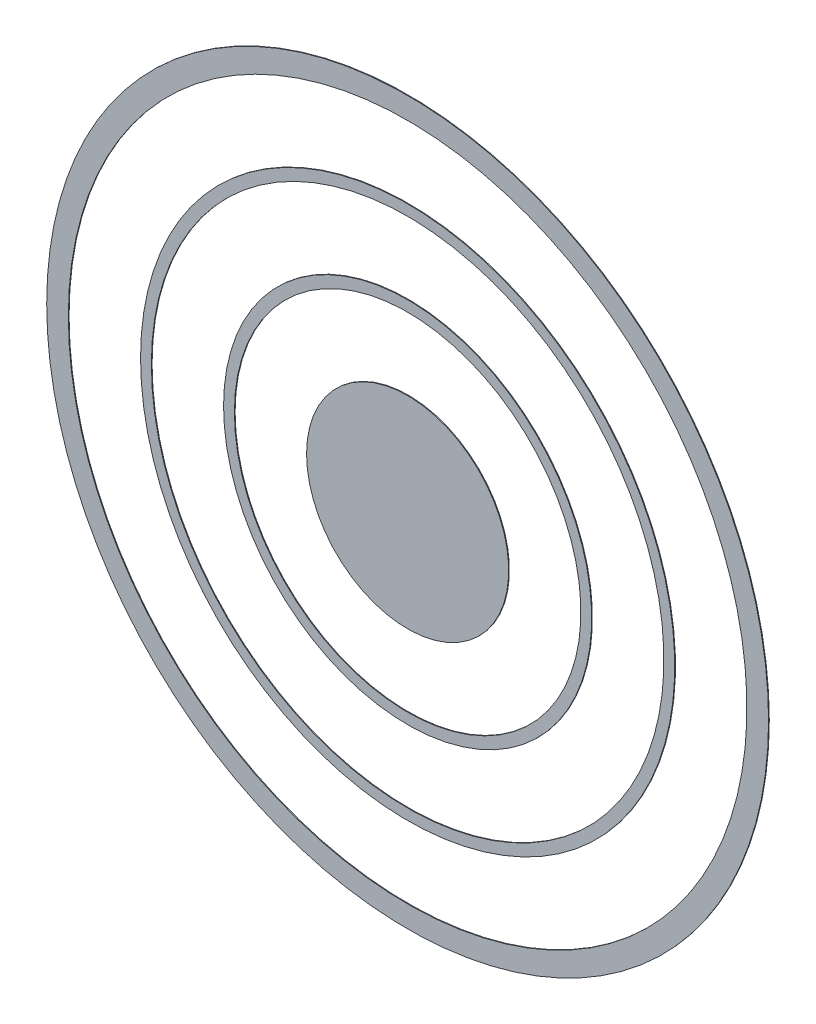
ISO-10303-21;
HEADER;
FILE_DESCRIPTION(('STEP AP214'),'2;1');
FILE_NAME('part.step','',(''),(''),'','','');
FILE_SCHEMA(('AUTOMOTIVE_DESIGN { 1 0 10303 214 1 1 1 1 }'));
ENDSEC;
DATA;
#1=APPLICATION_CONTEXT('core data for automotive mechanical design processes');
#2=APPLICATION_PROTOCOL_DEFINITION('international standard','automotive_design',2000,#1);
#3=PRODUCT_CONTEXT('',#1,'mechanical');
#4=PRODUCT('Part','Part','',(#3));
#5=PRODUCT_RELATED_PRODUCT_CATEGORY('part','',(#4));
#6=PRODUCT_DEFINITION_FORMATION('','',#4);
#7=PRODUCT_DEFINITION_CONTEXT('part definition',#1,'design');
#8=PRODUCT_DEFINITION('design','',#6,#7);
#9=PRODUCT_DEFINITION_SHAPE('','',#8);
#10=(LENGTH_UNIT() NAMED_UNIT(*) SI_UNIT(.MILLI.,.METRE.));
#11=(NAMED_UNIT(*) PLANE_ANGLE_UNIT() SI_UNIT($,.RADIAN.));
#12=(NAMED_UNIT(*) SI_UNIT($,.STERADIAN.) SOLID_ANGLE_UNIT());
#13=UNCERTAINTY_MEASURE_WITH_UNIT(LENGTH_MEASURE(1.E-05),#10,'distance_accuracy_value','');
#14=(GEOMETRIC_REPRESENTATION_CONTEXT(3) GLOBAL_UNCERTAINTY_ASSIGNED_CONTEXT((#13)) GLOBAL_UNIT_ASSIGNED_CONTEXT((#10,
#11,#12)) REPRESENTATION_CONTEXT('',''));
#15=CARTESIAN_POINT('',(0.,0.,0.));
#16=DIRECTION('',(0.,0.,1.));
#17=DIRECTION('',(1.,0.,0.));
#18=AXIS2_PLACEMENT_3D('',#15,#16,#17);
#19=CARTESIAN_POINT('',(0.,0.,0.01));
#20=DIRECTION('',(0.,0.,-1.));
#21=DIRECTION('',(-1.,0.,0.));
#22=AXIS2_PLACEMENT_3D('',#19,#20,#21);
#23=CYLINDRICAL_SURFACE('',#22,1.4);
#24=CARTESIAN_POINT('',(0.,0.,0.01));
#25=DIRECTION('',(0.,0.,1.));
#26=DIRECTION('',(1.,0.,0.));
#27=AXIS2_PLACEMENT_3D('',#24,#25,#26);
#28=CIRCLE('',#27,1.4);
#29=CARTESIAN_POINT('',(-1.4,0.,0.01));
#30=VERTEX_POINT('',#29);
#31=EDGE_CURVE('E12',#30,#30,#28,.T.);
#32=CARTESIAN_POINT('',(0.,0.,0.));
#33=DIRECTION('',(0.,0.,1.));
#34=DIRECTION('',(1.,0.,0.));
#35=AXIS2_PLACEMENT_3D('',#32,#33,#34);
#36=CIRCLE('',#35,1.4);
#37=CARTESIAN_POINT('',(-1.4,0.,0.));
#38=VERTEX_POINT('',#37);
#39=EDGE_CURVE('E83',#38,#38,#36,.T.);
#40=CARTESIAN_POINT('',(-1.4,0.,0.01));
#41=CARTESIAN_POINT('',(-1.4,0.,0.00989583333333333));
#42=CARTESIAN_POINT('',(-1.4,0.,0.00979166666666667));
#43=CARTESIAN_POINT('',(-1.4,0.,0.00958333333333333));
#44=CARTESIAN_POINT('',(-1.4,0.,0.00947916666666667));
#45=CARTESIAN_POINT('',(-1.4,0.,0.00927083333333333));
#46=CARTESIAN_POINT('',(-1.4,0.,0.00916666666666667));
#47=CARTESIAN_POINT('',(-1.4,0.,0.00895833333333333));
#48=CARTESIAN_POINT('',(-1.4,0.,0.00885416666666667));
#49=CARTESIAN_POINT('',(-1.4,0.,0.00864583333333333));
#50=CARTESIAN_POINT('',(-1.4,0.,0.00854166666666667));
#51=CARTESIAN_POINT('',(-1.4,0.,0.00833333333333333));
#52=CARTESIAN_POINT('',(-1.4,0.,0.00822916666666667));
#53=CARTESIAN_POINT('',(-1.4,0.,0.00802083333333333));
#54=CARTESIAN_POINT('',(-1.4,0.,0.00791666666666667));
#55=CARTESIAN_POINT('',(-1.4,0.,0.00770833333333333));
#56=CARTESIAN_POINT('',(-1.4,0.,0.00760416666666667));
#57=CARTESIAN_POINT('',(-1.4,0.,0.00739583333333333));
#58=CARTESIAN_POINT('',(-1.4,0.,0.00729166666666667));
#59=CARTESIAN_POINT('',(-1.4,0.,0.00708333333333333));
#60=CARTESIAN_POINT('',(-1.4,0.,0.00697916666666667));
#61=CARTESIAN_POINT('',(-1.4,0.,0.00677083333333333));
#62=CARTESIAN_POINT('',(-1.4,0.,0.00666666666666667));
#63=CARTESIAN_POINT('',(-1.4,0.,0.00645833333333333));
#64=CARTESIAN_POINT('',(-1.4,0.,0.00635416666666667));
#65=CARTESIAN_POINT('',(-1.4,0.,0.00614583333333333));
#66=CARTESIAN_POINT('',(-1.4,0.,0.00604166666666667));
#67=CARTESIAN_POINT('',(-1.4,0.,0.00583333333333333));
#68=CARTESIAN_POINT('',(-1.4,0.,0.00572916666666667));
#69=CARTESIAN_POINT('',(-1.4,0.,0.00552083333333333));
#70=CARTESIAN_POINT('',(-1.4,0.,0.00541666666666667));
#71=CARTESIAN_POINT('',(-1.4,0.,0.00520833333333333));
#72=CARTESIAN_POINT('',(-1.4,0.,0.00510416666666667));
#73=CARTESIAN_POINT('',(-1.4,0.,0.00489583333333333));
#74=CARTESIAN_POINT('',(-1.4,0.,0.00479166666666667));
#75=CARTESIAN_POINT('',(-1.4,0.,0.00458333333333333));
#76=CARTESIAN_POINT('',(-1.4,0.,0.00447916666666667));
#77=CARTESIAN_POINT('',(-1.4,0.,0.00427083333333333));
#78=CARTESIAN_POINT('',(-1.4,0.,0.00416666666666667));
#79=CARTESIAN_POINT('',(-1.4,0.,0.00395833333333333));
#80=CARTESIAN_POINT('',(-1.4,0.,0.00385416666666667));
#81=CARTESIAN_POINT('',(-1.4,0.,0.00364583333333333));
#82=CARTESIAN_POINT('',(-1.4,0.,0.00354166666666667));
#83=CARTESIAN_POINT('',(-1.4,0.,0.00333333333333333));
#84=CARTESIAN_POINT('',(-1.4,0.,0.00322916666666667));
#85=CARTESIAN_POINT('',(-1.4,0.,0.00302083333333333));
#86=CARTESIAN_POINT('',(-1.4,0.,0.00291666666666667));
#87=CARTESIAN_POINT('',(-1.4,0.,0.00270833333333333));
#88=CARTESIAN_POINT('',(-1.4,0.,0.00260416666666667));
#89=CARTESIAN_POINT('',(-1.4,0.,0.00239583333333333));
#90=CARTESIAN_POINT('',(-1.4,0.,0.00229166666666667));
#91=CARTESIAN_POINT('',(-1.4,0.,0.00208333333333333));
#92=CARTESIAN_POINT('',(-1.4,0.,0.00197916666666667));
#93=CARTESIAN_POINT('',(-1.4,0.,0.00177083333333333));
#94=CARTESIAN_POINT('',(-1.4,0.,0.00166666666666667));
#95=CARTESIAN_POINT('',(-1.4,0.,0.00145833333333333));
#96=CARTESIAN_POINT('',(-1.4,0.,0.00135416666666667));
#97=CARTESIAN_POINT('',(-1.4,0.,0.00114583333333333));
#98=CARTESIAN_POINT('',(-1.4,0.,0.00104166666666667));
#99=CARTESIAN_POINT('',(-1.4,0.,0.000833333333333334));
#100=CARTESIAN_POINT('',(-1.4,0.,0.000729166666666667));
#101=CARTESIAN_POINT('',(-1.4,0.,0.000520833333333334));
#102=CARTESIAN_POINT('',(-1.4,0.,0.000416666666666667));
#103=CARTESIAN_POINT('',(-1.4,0.,0.000208333333333334));
#104=CARTESIAN_POINT('',(-1.4,0.,0.000104166666666667));
#105=CARTESIAN_POINT('',(-1.4,0.,0.));
#106=B_SPLINE_CURVE_WITH_KNOTS('',3,(#40,#41,#42,#43,#44,#45,#46,#47,#48,#49,#50,#51,#52,#53,
#54,#55,#56,#57,#58,#59,#60,#61,#62,#63,#64,#65,#66,#67,#68,#69,#70,#71,#72,#73,#74,#75,#76,#77,
#78,#79,#80,#81,#82,#83,#84,#85,#86,#87,#88,#89,#90,#91,#92,#93,#94,#95,#96,#97,#98,#99,#100,
#101,#102,#103,#104,#105),.UNSPECIFIED.,.F.,.F.,(4,2,2,2,2,2,2,2,2,2,2,2,2,2,2,2,2,2,2,2,2,2,2,
2,2,2,2,2,2,2,2,2,4),(0.,0.000312500000000001,0.000625000000000002,0.000937500000000001,0.00125,
0.0015625,0.001875,0.0021875,0.0025,0.0028125,0.003125,0.0034375,0.00375,0.0040625,0.004375,
0.0046875,0.005,0.0053125,0.005625,0.0059375,0.00625,0.0065625,0.006875,0.0071875,0.0075,
0.0078125,0.008125,0.0084375,0.00875,0.0090625,0.009375,0.0096875,0.01),.UNSPECIFIED.);
#107=EDGE_CURVE('BSEAM80',#30,#38,#106,.T.);
#108=ORIENTED_EDGE('',*,*,#31,.F.);
#109=ORIENTED_EDGE('',*,*,#39,.T.);
#110=ORIENTED_EDGE('',*,*,#107,.T.);
#111=ORIENTED_EDGE('',*,*,#107,.F.);
#112=EDGE_LOOP('',(#108,#110,#109,#111));
#113=FACE_BOUND('',#112,.T.);
#114=ADVANCED_FACE('F80',(#113),#23,.T.);
#115=CARTESIAN_POINT('',(0.,0.,0.01));
#116=DIRECTION('',(0.,0.,1.));
#117=DIRECTION('',(1.,0.,0.));
#118=AXIS2_PLACEMENT_3D('',#115,#116,#117);
#119=PLANE('',#118);
#120=ORIENTED_EDGE('',*,*,#31,.T.);
#121=EDGE_LOOP('',(#120));
#122=FACE_BOUND('',#121,.T.);
#123=ADVANCED_FACE('F95',(#122),#119,.T.);
#124=CARTESIAN_POINT('',(0.,0.,0.));
#125=DIRECTION('',(0.,0.,1.));
#126=DIRECTION('',(1.,0.,0.));
#127=AXIS2_PLACEMENT_3D('',#124,#125,#126);
#128=PLANE('',#127);
#129=ORIENTED_EDGE('',*,*,#39,.F.);
#130=EDGE_LOOP('',(#129));
#131=FACE_BOUND('',#130,.T.);
#132=ADVANCED_FACE('F93',(#131),#128,.F.);
#133=CLOSED_SHELL('',(#114,#123,#132));
#134=MANIFOLD_SOLID_BREP('B2',#133);
#135=CARTESIAN_POINT('',(0.,0.,0.01));
#136=DIRECTION('',(0.,0.,-1.));
#137=DIRECTION('',(-1.,0.,0.));
#138=AXIS2_PLACEMENT_3D('',#135,#136,#137);
#139=CYLINDRICAL_SURFACE('',#138,2.4);
#140=CARTESIAN_POINT('',(0.,0.,0.01));
#141=DIRECTION('',(0.,0.,1.));
#142=DIRECTION('',(1.,0.,0.));
#143=AXIS2_PLACEMENT_3D('',#140,#141,#142);
#144=CIRCLE('',#143,2.4);
#145=CARTESIAN_POINT('',(-2.4,0.,0.01));
#146=VERTEX_POINT('',#145);
#147=EDGE_CURVE('E136',#146,#146,#144,.T.);
#148=CARTESIAN_POINT('',(0.,0.,0.));
#149=DIRECTION('',(0.,0.,1.));
#150=DIRECTION('',(1.,0.,0.));
#151=AXIS2_PLACEMENT_3D('',#148,#149,#150);
#152=CIRCLE('',#151,2.4);
#153=CARTESIAN_POINT('',(-2.4,0.,0.));
#154=VERTEX_POINT('',#153);
#155=EDGE_CURVE('E142',#154,#154,#152,.T.);
#156=CARTESIAN_POINT('',(-2.4,0.,0.01));
#157=CARTESIAN_POINT('',(-2.4,0.,0.00989583333333333));
#158=CARTESIAN_POINT('',(-2.4,0.,0.00979166666666667));
#159=CARTESIAN_POINT('',(-2.4,0.,0.00958333333333333));
#160=CARTESIAN_POINT('',(-2.4,0.,0.00947916666666667));
#161=CARTESIAN_POINT('',(-2.4,0.,0.00927083333333333));
#162=CARTESIAN_POINT('',(-2.4,0.,0.00916666666666667));
#163=CARTESIAN_POINT('',(-2.4,0.,0.00895833333333333));
#164=CARTESIAN_POINT('',(-2.4,0.,0.00885416666666667));
#165=CARTESIAN_POINT('',(-2.4,0.,0.00864583333333333));
#166=CARTESIAN_POINT('',(-2.4,0.,0.00854166666666667));
#167=CARTESIAN_POINT('',(-2.4,0.,0.00833333333333333));
#168=CARTESIAN_POINT('',(-2.4,0.,0.00822916666666667));
#169=CARTESIAN_POINT('',(-2.4,0.,0.00802083333333333));
#170=CARTESIAN_POINT('',(-2.4,0.,0.00791666666666667));
#171=CARTESIAN_POINT('',(-2.4,0.,0.00770833333333333));
#172=CARTESIAN_POINT('',(-2.4,0.,0.00760416666666667));
#173=CARTESIAN_POINT('',(-2.4,0.,0.00739583333333333));
#174=CARTESIAN_POINT('',(-2.4,0.,0.00729166666666667));
#175=CARTESIAN_POINT('',(-2.4,0.,0.00708333333333333));
#176=CARTESIAN_POINT('',(-2.4,0.,0.00697916666666667));
#177=CARTESIAN_POINT('',(-2.4,0.,0.00677083333333333));
#178=CARTESIAN_POINT('',(-2.4,0.,0.00666666666666667));
#179=CARTESIAN_POINT('',(-2.4,0.,0.00645833333333333));
#180=CARTESIAN_POINT('',(-2.4,0.,0.00635416666666667));
#181=CARTESIAN_POINT('',(-2.4,0.,0.00614583333333333));
#182=CARTESIAN_POINT('',(-2.4,0.,0.00604166666666667));
#183=CARTESIAN_POINT('',(-2.4,0.,0.00583333333333333));
#184=CARTESIAN_POINT('',(-2.4,0.,0.00572916666666667));
#185=CARTESIAN_POINT('',(-2.4,0.,0.00552083333333333));
#186=CARTESIAN_POINT('',(-2.4,0.,0.00541666666666667));
#187=CARTESIAN_POINT('',(-2.4,0.,0.00520833333333333));
#188=CARTESIAN_POINT('',(-2.4,0.,0.00510416666666667));
#189=CARTESIAN_POINT('',(-2.4,0.,0.00489583333333333));
#190=CARTESIAN_POINT('',(-2.4,0.,0.00479166666666667));
#191=CARTESIAN_POINT('',(-2.4,0.,0.00458333333333333));
#192=CARTESIAN_POINT('',(-2.4,0.,0.00447916666666667));
#193=CARTESIAN_POINT('',(-2.4,0.,0.00427083333333333));
#194=CARTESIAN_POINT('',(-2.4,0.,0.00416666666666667));
#195=CARTESIAN_POINT('',(-2.4,0.,0.00395833333333333));
#196=CARTESIAN_POINT('',(-2.4,0.,0.00385416666666667));
#197=CARTESIAN_POINT('',(-2.4,0.,0.00364583333333333));
#198=CARTESIAN_POINT('',(-2.4,0.,0.00354166666666667));
#199=CARTESIAN_POINT('',(-2.4,0.,0.00333333333333333));
#200=CARTESIAN_POINT('',(-2.4,0.,0.00322916666666667));
#201=CARTESIAN_POINT('',(-2.4,0.,0.00302083333333333));
#202=CARTESIAN_POINT('',(-2.4,0.,0.00291666666666667));
#203=CARTESIAN_POINT('',(-2.4,0.,0.00270833333333333));
#204=CARTESIAN_POINT('',(-2.4,0.,0.00260416666666667));
#205=CARTESIAN_POINT('',(-2.4,0.,0.00239583333333333));
#206=CARTESIAN_POINT('',(-2.4,0.,0.00229166666666667));
#207=CARTESIAN_POINT('',(-2.4,0.,0.00208333333333333));
#208=CARTESIAN_POINT('',(-2.4,0.,0.00197916666666667));
#209=CARTESIAN_POINT('',(-2.4,0.,0.00177083333333333));
#210=CARTESIAN_POINT('',(-2.4,0.,0.00166666666666667));
#211=CARTESIAN_POINT('',(-2.4,0.,0.00145833333333333));
#212=CARTESIAN_POINT('',(-2.4,0.,0.00135416666666667));
#213=CARTESIAN_POINT('',(-2.4,0.,0.00114583333333333));
#214=CARTESIAN_POINT('',(-2.4,0.,0.00104166666666667));
#215=CARTESIAN_POINT('',(-2.4,0.,0.000833333333333334));
#216=CARTESIAN_POINT('',(-2.4,0.,0.000729166666666667));
#217=CARTESIAN_POINT('',(-2.4,0.,0.000520833333333334));
#218=CARTESIAN_POINT('',(-2.4,0.,0.000416666666666667));
#219=CARTESIAN_POINT('',(-2.4,0.,0.000208333333333334));
#220=CARTESIAN_POINT('',(-2.4,0.,0.000104166666666667));
#221=CARTESIAN_POINT('',(-2.4,0.,0.));
#222=B_SPLINE_CURVE_WITH_KNOTS('',3,(#156,#157,#158,#159,#160,#161,#162,#163,#164,#165,#166,
#167,#168,#169,#170,#171,#172,#173,#174,#175,#176,#177,#178,#179,#180,#181,#182,#183,#184,#185,
#186,#187,#188,#189,#190,#191,#192,#193,#194,#195,#196,#197,#198,#199,#200,#201,#202,#203,#204,
#205,#206,#207,#208,#209,#210,#211,#212,#213,#214,#215,#216,#217,#218,#219,#220,#221),
.UNSPECIFIED.,.F.,.F.,(4,2,2,2,2,2,2,2,2,2,2,2,2,2,2,2,2,2,2,2,2,2,2,2,2,2,2,2,2,2,2,2,4),(0.,
0.000312499999999999,0.000624999999999998,0.000937499999999999,0.00125,0.0015625,0.001875,
0.0021875,0.0025,0.0028125,0.003125,0.0034375,0.00375,0.0040625,0.004375,0.0046875,0.005,
0.0053125,0.005625,0.0059375,0.00625,0.0065625,0.006875,0.0071875,0.0075,0.0078125,0.008125,
0.0084375,0.00875,0.0090625,0.009375,0.0096875,0.01),.UNSPECIFIED.);
#223=EDGE_CURVE('BSEAM129',#146,#154,#222,.T.);
#224=ORIENTED_EDGE('',*,*,#147,.T.);
#225=ORIENTED_EDGE('',*,*,#155,.F.);
#226=ORIENTED_EDGE('',*,*,#223,.T.);
#227=ORIENTED_EDGE('',*,*,#223,.F.);
#228=EDGE_LOOP('',(#224,#226,#225,#227));
#229=FACE_BOUND('',#228,.T.);
#230=ADVANCED_FACE('F129',(#229),#139,.F.);
#231=CARTESIAN_POINT('',(0.,0.,0.01));
#232=DIRECTION('',(0.,0.,-1.));
#233=DIRECTION('',(-1.,0.,0.));
#234=AXIS2_PLACEMENT_3D('',#231,#232,#233);
#235=CYLINDRICAL_SURFACE('',#234,2.55);
#236=CARTESIAN_POINT('',(0.,0.,0.01));
#237=DIRECTION('',(0.,0.,1.));
#238=DIRECTION('',(1.,0.,0.));
#239=AXIS2_PLACEMENT_3D('',#236,#237,#238);
#240=CIRCLE('',#239,2.55);
#241=CARTESIAN_POINT('',(-2.55,0.,0.01));
#242=VERTEX_POINT('',#241);
#243=EDGE_CURVE('E79',#242,#242,#240,.T.);
#244=CARTESIAN_POINT('',(0.,0.,0.));
#245=DIRECTION('',(0.,0.,1.));
#246=DIRECTION('',(1.,0.,0.));
#247=AXIS2_PLACEMENT_3D('',#244,#245,#246);
#248=CIRCLE('',#247,2.55);
#249=CARTESIAN_POINT('',(-2.55,0.,0.));
#250=VERTEX_POINT('',#249);
#251=EDGE_CURVE('E132',#250,#250,#248,.T.);
#252=CARTESIAN_POINT('',(-2.55,0.,0.01));
#253=CARTESIAN_POINT('',(-2.55,0.,0.00989583333333333));
#254=CARTESIAN_POINT('',(-2.55,0.,0.00979166666666667));
#255=CARTESIAN_POINT('',(-2.55,0.,0.00958333333333333));
#256=CARTESIAN_POINT('',(-2.55,0.,0.00947916666666667));
#257=CARTESIAN_POINT('',(-2.55,0.,0.00927083333333333));
#258=CARTESIAN_POINT('',(-2.55,0.,0.00916666666666667));
#259=CARTESIAN_POINT('',(-2.55,0.,0.00895833333333333));
#260=CARTESIAN_POINT('',(-2.55,0.,0.00885416666666667));
#261=CARTESIAN_POINT('',(-2.55,0.,0.00864583333333333));
#262=CARTESIAN_POINT('',(-2.55,0.,0.00854166666666667));
#263=CARTESIAN_POINT('',(-2.55,0.,0.00833333333333333));
#264=CARTESIAN_POINT('',(-2.55,0.,0.00822916666666667));
#265=CARTESIAN_POINT('',(-2.55,0.,0.00802083333333333));
#266=CARTESIAN_POINT('',(-2.55,0.,0.00791666666666667));
#267=CARTESIAN_POINT('',(-2.55,0.,0.00770833333333333));
#268=CARTESIAN_POINT('',(-2.55,0.,0.00760416666666667));
#269=CARTESIAN_POINT('',(-2.55,0.,0.00739583333333333));
#270=CARTESIAN_POINT('',(-2.55,0.,0.00729166666666667));
#271=CARTESIAN_POINT('',(-2.55,0.,0.00708333333333333));
#272=CARTESIAN_POINT('',(-2.55,0.,0.00697916666666667));
#273=CARTESIAN_POINT('',(-2.55,0.,0.00677083333333333));
#274=CARTESIAN_POINT('',(-2.55,0.,0.00666666666666667));
#275=CARTESIAN_POINT('',(-2.55,0.,0.00645833333333333));
#276=CARTESIAN_POINT('',(-2.55,0.,0.00635416666666667));
#277=CARTESIAN_POINT('',(-2.55,0.,0.00614583333333333));
#278=CARTESIAN_POINT('',(-2.55,0.,0.00604166666666667));
#279=CARTESIAN_POINT('',(-2.55,0.,0.00583333333333333));
#280=CARTESIAN_POINT('',(-2.55,0.,0.00572916666666667));
#281=CARTESIAN_POINT('',(-2.55,0.,0.00552083333333333));
#282=CARTESIAN_POINT('',(-2.55,0.,0.00541666666666667));
#283=CARTESIAN_POINT('',(-2.55,0.,0.00520833333333333));
#284=CARTESIAN_POINT('',(-2.55,0.,0.00510416666666667));
#285=CARTESIAN_POINT('',(-2.55,0.,0.00489583333333333));
#286=CARTESIAN_POINT('',(-2.55,0.,0.00479166666666667));
#287=CARTESIAN_POINT('',(-2.55,0.,0.00458333333333333));
#288=CARTESIAN_POINT('',(-2.55,0.,0.00447916666666667));
#289=CARTESIAN_POINT('',(-2.55,0.,0.00427083333333333));
#290=CARTESIAN_POINT('',(-2.55,0.,0.00416666666666667));
#291=CARTESIAN_POINT('',(-2.55,0.,0.00395833333333333));
#292=CARTESIAN_POINT('',(-2.55,0.,0.00385416666666667));
#293=CARTESIAN_POINT('',(-2.55,0.,0.00364583333333333));
#294=CARTESIAN_POINT('',(-2.55,0.,0.00354166666666667));
#295=CARTESIAN_POINT('',(-2.55,0.,0.00333333333333333));
#296=CARTESIAN_POINT('',(-2.55,0.,0.00322916666666667));
#297=CARTESIAN_POINT('',(-2.55,0.,0.00302083333333333));
#298=CARTESIAN_POINT('',(-2.55,0.,0.00291666666666667));
#299=CARTESIAN_POINT('',(-2.55,0.,0.00270833333333333));
#300=CARTESIAN_POINT('',(-2.55,0.,0.00260416666666667));
#301=CARTESIAN_POINT('',(-2.55,0.,0.00239583333333333));
#302=CARTESIAN_POINT('',(-2.55,0.,0.00229166666666667));
#303=CARTESIAN_POINT('',(-2.55,0.,0.00208333333333333));
#304=CARTESIAN_POINT('',(-2.55,0.,0.00197916666666667));
#305=CARTESIAN_POINT('',(-2.55,0.,0.00177083333333333));
#306=CARTESIAN_POINT('',(-2.55,0.,0.00166666666666667));
#307=CARTESIAN_POINT('',(-2.55,0.,0.00145833333333333));
#308=CARTESIAN_POINT('',(-2.55,0.,0.00135416666666667));
#309=CARTESIAN_POINT('',(-2.55,0.,0.00114583333333333));
#310=CARTESIAN_POINT('',(-2.55,0.,0.00104166666666667));
#311=CARTESIAN_POINT('',(-2.55,0.,0.000833333333333334));
#312=CARTESIAN_POINT('',(-2.55,0.,0.000729166666666667));
#313=CARTESIAN_POINT('',(-2.55,0.,0.000520833333333334));
#314=CARTESIAN_POINT('',(-2.55,0.,0.000416666666666667));
#315=CARTESIAN_POINT('',(-2.55,0.,0.000208333333333334));
#316=CARTESIAN_POINT('',(-2.55,0.,0.000104166666666667));
#317=CARTESIAN_POINT('',(-2.55,0.,0.));
#318=B_SPLINE_CURVE_WITH_KNOTS('',3,(#252,#253,#254,#255,#256,#257,#258,#259,#260,#261,#262,
#263,#264,#265,#266,#267,#268,#269,#270,#271,#272,#273,#274,#275,#276,#277,#278,#279,#280,#281,
#282,#283,#284,#285,#286,#287,#288,#289,#290,#291,#292,#293,#294,#295,#296,#297,#298,#299,#300,
#301,#302,#303,#304,#305,#306,#307,#308,#309,#310,#311,#312,#313,#314,#315,#316,#317),
.UNSPECIFIED.,.F.,.F.,(4,2,2,2,2,2,2,2,2,2,2,2,2,2,2,2,2,2,2,2,2,2,2,2,2,2,2,2,2,2,2,2,4),(0.,
0.000312500000000001,0.000625000000000002,0.000937500000000001,0.00125,0.0015625,0.001875,
0.0021875,0.0025,0.0028125,0.003125,0.0034375,0.00375,0.0040625,0.004375,0.0046875,0.005,
0.0053125,0.005625,0.0059375,0.00625,0.0065625,0.006875,0.0071875,0.0075,0.0078125,0.008125,
0.0084375,0.00875,0.0090625,0.009375,0.0096875,0.01),.UNSPECIFIED.);
#319=EDGE_CURVE('BSEAM149',#242,#250,#318,.T.);
#320=ORIENTED_EDGE('',*,*,#243,.F.);
#321=ORIENTED_EDGE('',*,*,#251,.T.);
#322=ORIENTED_EDGE('',*,*,#319,.T.);
#323=ORIENTED_EDGE('',*,*,#319,.F.);
#324=EDGE_LOOP('',(#320,#322,#321,#323));
#325=FACE_BOUND('',#324,.T.);
#326=ADVANCED_FACE('F149',(#325),#235,.T.);
#327=CARTESIAN_POINT('',(0.,0.,0.01));
#328=DIRECTION('',(0.,0.,1.));
#329=DIRECTION('',(1.,0.,0.));
#330=AXIS2_PLACEMENT_3D('',#327,#328,#329);
#331=PLANE('',#330);
#332=ORIENTED_EDGE('',*,*,#147,.F.);
#333=EDGE_LOOP('',(#332));
#334=FACE_BOUND('',#333,.T.);
#335=ORIENTED_EDGE('',*,*,#243,.T.);
#336=EDGE_LOOP('',(#335));
#337=FACE_BOUND('',#336,.T.);
#338=ADVANCED_FACE('F153',(#334,#337),#331,.T.);
#339=CARTESIAN_POINT('',(0.,0.,0.));
#340=DIRECTION('',(0.,0.,1.));
#341=DIRECTION('',(1.,0.,0.));
#342=AXIS2_PLACEMENT_3D('',#339,#340,#341);
#343=PLANE('',#342);
#344=ORIENTED_EDGE('',*,*,#155,.T.);
#345=EDGE_LOOP('',(#344));
#346=FACE_BOUND('',#345,.T.);
#347=ORIENTED_EDGE('',*,*,#251,.F.);
#348=EDGE_LOOP('',(#347));
#349=FACE_BOUND('',#348,.T.);
#350=ADVANCED_FACE('F151',(#346,#349),#343,.F.);
#351=CLOSED_SHELL('',(#230,#326,#338,#350));
#352=MANIFOLD_SOLID_BREP('B7',#351);
#353=CARTESIAN_POINT('',(0.,0.,0.01));
#354=DIRECTION('',(0.,0.,-1.));
#355=DIRECTION('',(-1.,0.,0.));
#356=AXIS2_PLACEMENT_3D('',#353,#354,#355);
#357=CYLINDRICAL_SURFACE('',#356,3.55);
#358=CARTESIAN_POINT('',(0.,0.,0.01));
#359=DIRECTION('',(0.,0.,1.));
#360=DIRECTION('',(1.,0.,0.));
#361=AXIS2_PLACEMENT_3D('',#358,#359,#360);
#362=CIRCLE('',#361,3.55);
#363=CARTESIAN_POINT('',(-3.55,0.,0.01));
#364=VERTEX_POINT('',#363);
#365=EDGE_CURVE('E205',#364,#364,#362,.T.);
#366=CARTESIAN_POINT('',(0.,0.,0.));
#367=DIRECTION('',(0.,0.,1.));
#368=DIRECTION('',(1.,0.,0.));
#369=AXIS2_PLACEMENT_3D('',#366,#367,#368);
#370=CIRCLE('',#369,3.55);
#371=CARTESIAN_POINT('',(-3.55,0.,0.));
#372=VERTEX_POINT('',#371);
#373=EDGE_CURVE('E211',#372,#372,#370,.T.);
#374=CARTESIAN_POINT('',(-3.55,0.,0.01));
#375=CARTESIAN_POINT('',(-3.55,0.,0.00989583333333333));
#376=CARTESIAN_POINT('',(-3.55,0.,0.00979166666666667));
#377=CARTESIAN_POINT('',(-3.55,0.,0.00958333333333333));
#378=CARTESIAN_POINT('',(-3.55,0.,0.00947916666666667));
#379=CARTESIAN_POINT('',(-3.55,0.,0.00927083333333333));
#380=CARTESIAN_POINT('',(-3.55,0.,0.00916666666666667));
#381=CARTESIAN_POINT('',(-3.55,0.,0.00895833333333333));
#382=CARTESIAN_POINT('',(-3.55,0.,0.00885416666666667));
#383=CARTESIAN_POINT('',(-3.55,0.,0.00864583333333333));
#384=CARTESIAN_POINT('',(-3.55,0.,0.00854166666666667));
#385=CARTESIAN_POINT('',(-3.55,0.,0.00833333333333333));
#386=CARTESIAN_POINT('',(-3.55,0.,0.00822916666666667));
#387=CARTESIAN_POINT('',(-3.55,0.,0.00802083333333333));
#388=CARTESIAN_POINT('',(-3.55,0.,0.00791666666666667));
#389=CARTESIAN_POINT('',(-3.55,0.,0.00770833333333333));
#390=CARTESIAN_POINT('',(-3.55,0.,0.00760416666666667));
#391=CARTESIAN_POINT('',(-3.55,0.,0.00739583333333333));
#392=CARTESIAN_POINT('',(-3.55,0.,0.00729166666666667));
#393=CARTESIAN_POINT('',(-3.55,0.,0.00708333333333333));
#394=CARTESIAN_POINT('',(-3.55,0.,0.00697916666666667));
#395=CARTESIAN_POINT('',(-3.55,0.,0.00677083333333333));
#396=CARTESIAN_POINT('',(-3.55,0.,0.00666666666666667));
#397=CARTESIAN_POINT('',(-3.55,0.,0.00645833333333333));
#398=CARTESIAN_POINT('',(-3.55,0.,0.00635416666666667));
#399=CARTESIAN_POINT('',(-3.55,0.,0.00614583333333333));
#400=CARTESIAN_POINT('',(-3.55,0.,0.00604166666666667));
#401=CARTESIAN_POINT('',(-3.55,0.,0.00583333333333333));
#402=CARTESIAN_POINT('',(-3.55,0.,0.00572916666666667));
#403=CARTESIAN_POINT('',(-3.55,0.,0.00552083333333333));
#404=CARTESIAN_POINT('',(-3.55,0.,0.00541666666666667));
#405=CARTESIAN_POINT('',(-3.55,0.,0.00520833333333333));
#406=CARTESIAN_POINT('',(-3.55,0.,0.00510416666666667));
#407=CARTESIAN_POINT('',(-3.55,0.,0.00489583333333333));
#408=CARTESIAN_POINT('',(-3.55,0.,0.00479166666666667));
#409=CARTESIAN_POINT('',(-3.55,0.,0.00458333333333333));
#410=CARTESIAN_POINT('',(-3.55,0.,0.00447916666666667));
#411=CARTESIAN_POINT('',(-3.55,0.,0.00427083333333333));
#412=CARTESIAN_POINT('',(-3.55,0.,0.00416666666666667));
#413=CARTESIAN_POINT('',(-3.55,0.,0.00395833333333333));
#414=CARTESIAN_POINT('',(-3.55,0.,0.00385416666666667));
#415=CARTESIAN_POINT('',(-3.55,0.,0.00364583333333333));
#416=CARTESIAN_POINT('',(-3.55,0.,0.00354166666666667));
#417=CARTESIAN_POINT('',(-3.55,0.,0.00333333333333333));
#418=CARTESIAN_POINT('',(-3.55,0.,0.00322916666666667));
#419=CARTESIAN_POINT('',(-3.55,0.,0.00302083333333333));
#420=CARTESIAN_POINT('',(-3.55,0.,0.00291666666666667));
#421=CARTESIAN_POINT('',(-3.55,0.,0.00270833333333333));
#422=CARTESIAN_POINT('',(-3.55,0.,0.00260416666666667));
#423=CARTESIAN_POINT('',(-3.55,0.,0.00239583333333333));
#424=CARTESIAN_POINT('',(-3.55,0.,0.00229166666666667));
#425=CARTESIAN_POINT('',(-3.55,0.,0.00208333333333333));
#426=CARTESIAN_POINT('',(-3.55,0.,0.00197916666666667));
#427=CARTESIAN_POINT('',(-3.55,0.,0.00177083333333333));
#428=CARTESIAN_POINT('',(-3.55,0.,0.00166666666666667));
#429=CARTESIAN_POINT('',(-3.55,0.,0.00145833333333333));
#430=CARTESIAN_POINT('',(-3.55,0.,0.00135416666666667));
#431=CARTESIAN_POINT('',(-3.55,0.,0.00114583333333333));
#432=CARTESIAN_POINT('',(-3.55,0.,0.00104166666666667));
#433=CARTESIAN_POINT('',(-3.55,0.,0.000833333333333334));
#434=CARTESIAN_POINT('',(-3.55,0.,0.000729166666666667));
#435=CARTESIAN_POINT('',(-3.55,0.,0.000520833333333334));
#436=CARTESIAN_POINT('',(-3.55,0.,0.000416666666666667));
#437=CARTESIAN_POINT('',(-3.55,0.,0.000208333333333334));
#438=CARTESIAN_POINT('',(-3.55,0.,0.000104166666666667));
#439=CARTESIAN_POINT('',(-3.55,0.,0.));
#440=B_SPLINE_CURVE_WITH_KNOTS('',3,(#374,#375,#376,#377,#378,#379,#380,#381,#382,#383,#384,
#385,#386,#387,#388,#389,#390,#391,#392,#393,#394,#395,#396,#397,#398,#399,#400,#401,#402,#403,
#404,#405,#406,#407,#408,#409,#410,#411,#412,#413,#414,#415,#416,#417,#418,#419,#420,#421,#422,
#423,#424,#425,#426,#427,#428,#429,#430,#431,#432,#433,#434,#435,#436,#437,#438,#439),
.UNSPECIFIED.,.F.,.F.,(4,2,2,2,2,2,2,2,2,2,2,2,2,2,2,2,2,2,2,2,2,2,2,2,2,2,2,2,2,2,2,2,4),(0.,
0.000312499999999999,0.000624999999999998,0.000937499999999999,0.00125,0.0015625,0.001875,
0.0021875,0.0025,0.0028125,0.003125,0.0034375,0.00375,0.0040625,0.004375,0.0046875,0.005,
0.0053125,0.005625,0.0059375,0.00625,0.0065625,0.006875,0.0071875,0.0075,0.0078125,0.008125,
0.0084375,0.00875,0.0090625,0.009375,0.0096875,0.01),.UNSPECIFIED.);
#441=EDGE_CURVE('BSEAM198',#364,#372,#440,.T.);
#442=ORIENTED_EDGE('',*,*,#365,.T.);
#443=ORIENTED_EDGE('',*,*,#373,.F.);
#444=ORIENTED_EDGE('',*,*,#441,.T.);
#445=ORIENTED_EDGE('',*,*,#441,.F.);
#446=EDGE_LOOP('',(#442,#444,#443,#445));
#447=FACE_BOUND('',#446,.T.);
#448=ADVANCED_FACE('F198',(#447),#357,.F.);
#449=CARTESIAN_POINT('',(0.,0.,0.01));
#450=DIRECTION('',(0.,0.,-1.));
#451=DIRECTION('',(-1.,0.,0.));
#452=AXIS2_PLACEMENT_3D('',#449,#450,#451);
#453=CYLINDRICAL_SURFACE('',#452,3.7);
#454=CARTESIAN_POINT('',(0.,0.,0.01));
#455=DIRECTION('',(0.,0.,1.));
#456=DIRECTION('',(1.,0.,0.));
#457=AXIS2_PLACEMENT_3D('',#454,#455,#456);
#458=CIRCLE('',#457,3.7);
#459=CARTESIAN_POINT('',(-3.7,0.,0.01));
#460=VERTEX_POINT('',#459);
#461=EDGE_CURVE('E128',#460,#460,#458,.T.);
#462=CARTESIAN_POINT('',(0.,0.,0.));
#463=DIRECTION('',(0.,0.,1.));
#464=DIRECTION('',(1.,0.,0.));
#465=AXIS2_PLACEMENT_3D('',#462,#463,#464);
#466=CIRCLE('',#465,3.7);
#467=CARTESIAN_POINT('',(-3.7,0.,0.));
#468=VERTEX_POINT('',#467);
#469=EDGE_CURVE('E201',#468,#468,#466,.T.);
#470=CARTESIAN_POINT('',(-3.7,0.,0.01));
#471=CARTESIAN_POINT('',(-3.7,0.,0.00989583333333333));
#472=CARTESIAN_POINT('',(-3.7,0.,0.00979166666666667));
#473=CARTESIAN_POINT('',(-3.7,0.,0.00958333333333333));
#474=CARTESIAN_POINT('',(-3.7,0.,0.00947916666666667));
#475=CARTESIAN_POINT('',(-3.7,0.,0.00927083333333333));
#476=CARTESIAN_POINT('',(-3.7,0.,0.00916666666666667));
#477=CARTESIAN_POINT('',(-3.7,0.,0.00895833333333333));
#478=CARTESIAN_POINT('',(-3.7,0.,0.00885416666666667));
#479=CARTESIAN_POINT('',(-3.7,0.,0.00864583333333333));
#480=CARTESIAN_POINT('',(-3.7,0.,0.00854166666666667));
#481=CARTESIAN_POINT('',(-3.7,0.,0.00833333333333333));
#482=CARTESIAN_POINT('',(-3.7,0.,0.00822916666666667));
#483=CARTESIAN_POINT('',(-3.7,0.,0.00802083333333333));
#484=CARTESIAN_POINT('',(-3.7,0.,0.00791666666666667));
#485=CARTESIAN_POINT('',(-3.7,0.,0.00770833333333333));
#486=CARTESIAN_POINT('',(-3.7,0.,0.00760416666666667));
#487=CARTESIAN_POINT('',(-3.7,0.,0.00739583333333333));
#488=CARTESIAN_POINT('',(-3.7,0.,0.00729166666666667));
#489=CARTESIAN_POINT('',(-3.7,0.,0.00708333333333333));
#490=CARTESIAN_POINT('',(-3.7,0.,0.00697916666666667));
#491=CARTESIAN_POINT('',(-3.7,0.,0.00677083333333333));
#492=CARTESIAN_POINT('',(-3.7,0.,0.00666666666666667));
#493=CARTESIAN_POINT('',(-3.7,0.,0.00645833333333333));
#494=CARTESIAN_POINT('',(-3.7,0.,0.00635416666666667));
#495=CARTESIAN_POINT('',(-3.7,0.,0.00614583333333333));
#496=CARTESIAN_POINT('',(-3.7,0.,0.00604166666666667));
#497=CARTESIAN_POINT('',(-3.7,0.,0.00583333333333333));
#498=CARTESIAN_POINT('',(-3.7,0.,0.00572916666666667));
#499=CARTESIAN_POINT('',(-3.7,0.,0.00552083333333333));
#500=CARTESIAN_POINT('',(-3.7,0.,0.00541666666666667));
#501=CARTESIAN_POINT('',(-3.7,0.,0.00520833333333333));
#502=CARTESIAN_POINT('',(-3.7,0.,0.00510416666666667));
#503=CARTESIAN_POINT('',(-3.7,0.,0.00489583333333333));
#504=CARTESIAN_POINT('',(-3.7,0.,0.00479166666666667));
#505=CARTESIAN_POINT('',(-3.7,0.,0.00458333333333333));
#506=CARTESIAN_POINT('',(-3.7,0.,0.00447916666666667));
#507=CARTESIAN_POINT('',(-3.7,0.,0.00427083333333333));
#508=CARTESIAN_POINT('',(-3.7,0.,0.00416666666666667));
#509=CARTESIAN_POINT('',(-3.7,0.,0.00395833333333333));
#510=CARTESIAN_POINT('',(-3.7,0.,0.00385416666666667));
#511=CARTESIAN_POINT('',(-3.7,0.,0.00364583333333333));
#512=CARTESIAN_POINT('',(-3.7,0.,0.00354166666666667));
#513=CARTESIAN_POINT('',(-3.7,0.,0.00333333333333333));
#514=CARTESIAN_POINT('',(-3.7,0.,0.00322916666666667));
#515=CARTESIAN_POINT('',(-3.7,0.,0.00302083333333333));
#516=CARTESIAN_POINT('',(-3.7,0.,0.00291666666666667));
#517=CARTESIAN_POINT('',(-3.7,0.,0.00270833333333333));
#518=CARTESIAN_POINT('',(-3.7,0.,0.00260416666666667));
#519=CARTESIAN_POINT('',(-3.7,0.,0.00239583333333333));
#520=CARTESIAN_POINT('',(-3.7,0.,0.00229166666666667));
#521=CARTESIAN_POINT('',(-3.7,0.,0.00208333333333333));
#522=CARTESIAN_POINT('',(-3.7,0.,0.00197916666666667));
#523=CARTESIAN_POINT('',(-3.7,0.,0.00177083333333333));
#524=CARTESIAN_POINT('',(-3.7,0.,0.00166666666666667));
#525=CARTESIAN_POINT('',(-3.7,0.,0.00145833333333333));
#526=CARTESIAN_POINT('',(-3.7,0.,0.00135416666666667));
#527=CARTESIAN_POINT('',(-3.7,0.,0.00114583333333333));
#528=CARTESIAN_POINT('',(-3.7,0.,0.00104166666666667));
#529=CARTESIAN_POINT('',(-3.7,0.,0.000833333333333334));
#530=CARTESIAN_POINT('',(-3.7,0.,0.000729166666666667));
#531=CARTESIAN_POINT('',(-3.7,0.,0.000520833333333334));
#532=CARTESIAN_POINT('',(-3.7,0.,0.000416666666666667));
#533=CARTESIAN_POINT('',(-3.7,0.,0.000208333333333334));
#534=CARTESIAN_POINT('',(-3.7,0.,0.000104166666666667));
#535=CARTESIAN_POINT('',(-3.7,0.,0.));
#536=B_SPLINE_CURVE_WITH_KNOTS('',3,(#470,#471,#472,#473,#474,#475,#476,#477,#478,#479,#480,
#481,#482,#483,#484,#485,#486,#487,#488,#489,#490,#491,#492,#493,#494,#495,#496,#497,#498,#499,
#500,#501,#502,#503,#504,#505,#506,#507,#508,#509,#510,#511,#512,#513,#514,#515,#516,#517,#518,
#519,#520,#521,#522,#523,#524,#525,#526,#527,#528,#529,#530,#531,#532,#533,#534,#535),
.UNSPECIFIED.,.F.,.F.,(4,2,2,2,2,2,2,2,2,2,2,2,2,2,2,2,2,2,2,2,2,2,2,2,2,2,2,2,2,2,2,2,4),(0.,
0.000312499999999999,0.000624999999999998,0.000937499999999999,0.00125,0.0015625,0.001875,
0.0021875,0.0025,0.0028125,0.003125,0.0034375,0.00375,0.0040625,0.004375,0.0046875,0.005,
0.0053125,0.005625,0.0059375,0.00625,0.0065625,0.006875,0.0071875,0.0075,0.0078125,0.008125,
0.0084375,0.00875,0.0090625,0.009375,0.0096875,0.01),.UNSPECIFIED.);
#537=EDGE_CURVE('BSEAM218',#460,#468,#536,.T.);
#538=ORIENTED_EDGE('',*,*,#461,.F.);
#539=ORIENTED_EDGE('',*,*,#469,.T.);
#540=ORIENTED_EDGE('',*,*,#537,.T.);
#541=ORIENTED_EDGE('',*,*,#537,.F.);
#542=EDGE_LOOP('',(#538,#540,#539,#541));
#543=FACE_BOUND('',#542,.T.);
#544=ADVANCED_FACE('F218',(#543),#453,.T.);
#545=CARTESIAN_POINT('',(0.,0.,0.01));
#546=DIRECTION('',(0.,0.,1.));
#547=DIRECTION('',(1.,0.,0.));
#548=AXIS2_PLACEMENT_3D('',#545,#546,#547);
#549=PLANE('',#548);
#550=ORIENTED_EDGE('',*,*,#365,.F.);
#551=EDGE_LOOP('',(#550));
#552=FACE_BOUND('',#551,.T.);
#553=ORIENTED_EDGE('',*,*,#461,.T.);
#554=EDGE_LOOP('',(#553));
#555=FACE_BOUND('',#554,.T.);
#556=ADVANCED_FACE('F222',(#552,#555),#549,.T.);
#557=CARTESIAN_POINT('',(0.,0.,0.));
#558=DIRECTION('',(0.,0.,1.));
#559=DIRECTION('',(1.,0.,0.));
#560=AXIS2_PLACEMENT_3D('',#557,#558,#559);
#561=PLANE('',#560);
#562=ORIENTED_EDGE('',*,*,#373,.T.);
#563=EDGE_LOOP('',(#562));
#564=FACE_BOUND('',#563,.T.);
#565=ORIENTED_EDGE('',*,*,#469,.F.);
#566=EDGE_LOOP('',(#565));
#567=FACE_BOUND('',#566,.T.);
#568=ADVANCED_FACE('F220',(#564,#567),#561,.F.);
#569=CLOSED_SHELL('',(#448,#544,#556,#568));
#570=MANIFOLD_SOLID_BREP('B74',#569);
#571=CARTESIAN_POINT('',(0.,0.,0.01));
#572=DIRECTION('',(0.,0.,-1.));
#573=DIRECTION('',(-1.,0.,0.));
#574=AXIS2_PLACEMENT_3D('',#571,#572,#573);
#575=CYLINDRICAL_SURFACE('',#574,4.7);
#576=CARTESIAN_POINT('',(0.,0.,0.01));
#577=DIRECTION('',(0.,0.,1.));
#578=DIRECTION('',(1.,0.,0.));
#579=AXIS2_PLACEMENT_3D('',#576,#577,#578);
#580=CIRCLE('',#579,4.7);
#581=CARTESIAN_POINT('',(-4.7,0.,0.01));
#582=VERTEX_POINT('',#581);
#583=EDGE_CURVE('E267',#582,#582,#580,.T.);
#584=CARTESIAN_POINT('',(0.,0.,0.));
#585=DIRECTION('',(0.,0.,1.));
#586=DIRECTION('',(1.,0.,0.));
#587=AXIS2_PLACEMENT_3D('',#584,#585,#586);
#588=CIRCLE('',#587,4.7);
#589=CARTESIAN_POINT('',(-4.7,0.,0.));
#590=VERTEX_POINT('',#589);
#591=EDGE_CURVE('E273',#590,#590,#588,.T.);
#592=CARTESIAN_POINT('',(-4.7,0.,0.01));
#593=CARTESIAN_POINT('',(-4.7,0.,0.00989583333333333));
#594=CARTESIAN_POINT('',(-4.7,0.,0.00979166666666667));
#595=CARTESIAN_POINT('',(-4.7,0.,0.00958333333333333));
#596=CARTESIAN_POINT('',(-4.7,0.,0.00947916666666667));
#597=CARTESIAN_POINT('',(-4.7,0.,0.00927083333333333));
#598=CARTESIAN_POINT('',(-4.7,0.,0.00916666666666667));
#599=CARTESIAN_POINT('',(-4.7,0.,0.00895833333333333));
#600=CARTESIAN_POINT('',(-4.7,0.,0.00885416666666667));
#601=CARTESIAN_POINT('',(-4.7,0.,0.00864583333333333));
#602=CARTESIAN_POINT('',(-4.7,0.,0.00854166666666667));
#603=CARTESIAN_POINT('',(-4.7,0.,0.00833333333333333));
#604=CARTESIAN_POINT('',(-4.7,0.,0.00822916666666667));
#605=CARTESIAN_POINT('',(-4.7,0.,0.00802083333333333));
#606=CARTESIAN_POINT('',(-4.7,0.,0.00791666666666667));
#607=CARTESIAN_POINT('',(-4.7,0.,0.00770833333333333));
#608=CARTESIAN_POINT('',(-4.7,0.,0.00760416666666667));
#609=CARTESIAN_POINT('',(-4.7,0.,0.00739583333333333));
#610=CARTESIAN_POINT('',(-4.7,0.,0.00729166666666667));
#611=CARTESIAN_POINT('',(-4.7,0.,0.00708333333333333));
#612=CARTESIAN_POINT('',(-4.7,0.,0.00697916666666667));
#613=CARTESIAN_POINT('',(-4.7,0.,0.00677083333333333));
#614=CARTESIAN_POINT('',(-4.7,0.,0.00666666666666667));
#615=CARTESIAN_POINT('',(-4.7,0.,0.00645833333333333));
#616=CARTESIAN_POINT('',(-4.7,0.,0.00635416666666667));
#617=CARTESIAN_POINT('',(-4.7,0.,0.00614583333333333));
#618=CARTESIAN_POINT('',(-4.7,0.,0.00604166666666667));
#619=CARTESIAN_POINT('',(-4.7,0.,0.00583333333333333));
#620=CARTESIAN_POINT('',(-4.7,0.,0.00572916666666667));
#621=CARTESIAN_POINT('',(-4.7,0.,0.00552083333333333));
#622=CARTESIAN_POINT('',(-4.7,0.,0.00541666666666667));
#623=CARTESIAN_POINT('',(-4.7,0.,0.00520833333333333));
#624=CARTESIAN_POINT('',(-4.7,0.,0.00510416666666667));
#625=CARTESIAN_POINT('',(-4.7,0.,0.00489583333333333));
#626=CARTESIAN_POINT('',(-4.7,0.,0.00479166666666667));
#627=CARTESIAN_POINT('',(-4.7,0.,0.00458333333333333));
#628=CARTESIAN_POINT('',(-4.7,0.,0.00447916666666667));
#629=CARTESIAN_POINT('',(-4.7,0.,0.00427083333333333));
#630=CARTESIAN_POINT('',(-4.7,0.,0.00416666666666667));
#631=CARTESIAN_POINT('',(-4.7,0.,0.00395833333333333));
#632=CARTESIAN_POINT('',(-4.7,0.,0.00385416666666667));
#633=CARTESIAN_POINT('',(-4.7,0.,0.00364583333333333));
#634=CARTESIAN_POINT('',(-4.7,0.,0.00354166666666667));
#635=CARTESIAN_POINT('',(-4.7,0.,0.00333333333333333));
#636=CARTESIAN_POINT('',(-4.7,0.,0.00322916666666667));
#637=CARTESIAN_POINT('',(-4.7,0.,0.00302083333333333));
#638=CARTESIAN_POINT('',(-4.7,0.,0.00291666666666667));
#639=CARTESIAN_POINT('',(-4.7,0.,0.00270833333333333));
#640=CARTESIAN_POINT('',(-4.7,0.,0.00260416666666667));
#641=CARTESIAN_POINT('',(-4.7,0.,0.00239583333333333));
#642=CARTESIAN_POINT('',(-4.7,0.,0.00229166666666667));
#643=CARTESIAN_POINT('',(-4.7,0.,0.00208333333333333));
#644=CARTESIAN_POINT('',(-4.7,0.,0.00197916666666667));
#645=CARTESIAN_POINT('',(-4.7,0.,0.00177083333333333));
#646=CARTESIAN_POINT('',(-4.7,0.,0.00166666666666667));
#647=CARTESIAN_POINT('',(-4.7,0.,0.00145833333333333));
#648=CARTESIAN_POINT('',(-4.7,0.,0.00135416666666667));
#649=CARTESIAN_POINT('',(-4.7,0.,0.00114583333333333));
#650=CARTESIAN_POINT('',(-4.7,0.,0.00104166666666667));
#651=CARTESIAN_POINT('',(-4.7,0.,0.000833333333333334));
#652=CARTESIAN_POINT('',(-4.7,0.,0.000729166666666667));
#653=CARTESIAN_POINT('',(-4.7,0.,0.000520833333333334));
#654=CARTESIAN_POINT('',(-4.7,0.,0.000416666666666667));
#655=CARTESIAN_POINT('',(-4.7,0.,0.000208333333333334));
#656=CARTESIAN_POINT('',(-4.7,0.,0.000104166666666667));
#657=CARTESIAN_POINT('',(-4.7,0.,0.));
#658=B_SPLINE_CURVE_WITH_KNOTS('',3,(#592,#593,#594,#595,#596,#597,#598,#599,#600,#601,#602,
#603,#604,#605,#606,#607,#608,#609,#610,#611,#612,#613,#614,#615,#616,#617,#618,#619,#620,#621,
#622,#623,#624,#625,#626,#627,#628,#629,#630,#631,#632,#633,#634,#635,#636,#637,#638,#639,#640,
#641,#642,#643,#644,#645,#646,#647,#648,#649,#650,#651,#652,#653,#654,#655,#656,#657),
.UNSPECIFIED.,.F.,.F.,(4,2,2,2,2,2,2,2,2,2,2,2,2,2,2,2,2,2,2,2,2,2,2,2,2,2,2,2,2,2,2,2,4),(0.,
0.000312499999999999,0.000624999999999998,0.000937499999999999,0.00125,0.0015625,0.001875,
0.0021875,0.0025,0.0028125,0.003125,0.0034375,0.00375,0.0040625,0.004375,0.0046875,0.005,
0.0053125,0.005625,0.0059375,0.00625,0.0065625,0.006875,0.0071875,0.0075,0.0078125,0.008125,
0.0084375,0.00875,0.0090625,0.009375,0.0096875,0.01),.UNSPECIFIED.);
#659=EDGE_CURVE('BSEAM260',#582,#590,#658,.T.);
#660=ORIENTED_EDGE('',*,*,#583,.T.);
#661=ORIENTED_EDGE('',*,*,#591,.F.);
#662=ORIENTED_EDGE('',*,*,#659,.T.);
#663=ORIENTED_EDGE('',*,*,#659,.F.);
#664=EDGE_LOOP('',(#660,#662,#661,#663));
#665=FACE_BOUND('',#664,.T.);
#666=ADVANCED_FACE('F260',(#665),#575,.F.);
#667=CARTESIAN_POINT('',(0.,0.,0.01));
#668=DIRECTION('',(0.,0.,-1.));
#669=DIRECTION('',(-1.,0.,0.));
#670=AXIS2_PLACEMENT_3D('',#667,#668,#669);
#671=CYLINDRICAL_SURFACE('',#670,5.);
#672=CARTESIAN_POINT('',(0.,0.,0.01));
#673=DIRECTION('',(0.,0.,1.));
#674=DIRECTION('',(1.,0.,0.));
#675=AXIS2_PLACEMENT_3D('',#672,#673,#674);
#676=CIRCLE('',#675,5.);
#677=CARTESIAN_POINT('',(-5.,0.,0.01));
#678=VERTEX_POINT('',#677);
#679=EDGE_CURVE('E197',#678,#678,#676,.T.);
#680=CARTESIAN_POINT('',(0.,0.,0.));
#681=DIRECTION('',(0.,0.,1.));
#682=DIRECTION('',(1.,0.,0.));
#683=AXIS2_PLACEMENT_3D('',#680,#681,#682);
#684=CIRCLE('',#683,5.);
#685=CARTESIAN_POINT('',(-5.,0.,0.));
#686=VERTEX_POINT('',#685);
#687=EDGE_CURVE('E263',#686,#686,#684,.T.);
#688=CARTESIAN_POINT('',(-5.,0.,0.01));
#689=CARTESIAN_POINT('',(-5.,0.,0.00989583333333333));
#690=CARTESIAN_POINT('',(-5.,0.,0.00979166666666667));
#691=CARTESIAN_POINT('',(-5.,0.,0.00958333333333333));
#692=CARTESIAN_POINT('',(-5.,0.,0.00947916666666667));
#693=CARTESIAN_POINT('',(-5.,0.,0.00927083333333333));
#694=CARTESIAN_POINT('',(-5.,0.,0.00916666666666667));
#695=CARTESIAN_POINT('',(-5.,0.,0.00895833333333333));
#696=CARTESIAN_POINT('',(-5.,0.,0.00885416666666667));
#697=CARTESIAN_POINT('',(-5.,0.,0.00864583333333333));
#698=CARTESIAN_POINT('',(-5.,0.,0.00854166666666667));
#699=CARTESIAN_POINT('',(-5.,0.,0.00833333333333333));
#700=CARTESIAN_POINT('',(-5.,0.,0.00822916666666667));
#701=CARTESIAN_POINT('',(-5.,0.,0.00802083333333333));
#702=CARTESIAN_POINT('',(-5.,0.,0.00791666666666667));
#703=CARTESIAN_POINT('',(-5.,0.,0.00770833333333333));
#704=CARTESIAN_POINT('',(-5.,0.,0.00760416666666667));
#705=CARTESIAN_POINT('',(-5.,0.,0.00739583333333333));
#706=CARTESIAN_POINT('',(-5.,0.,0.00729166666666667));
#707=CARTESIAN_POINT('',(-5.,0.,0.00708333333333333));
#708=CARTESIAN_POINT('',(-5.,0.,0.00697916666666667));
#709=CARTESIAN_POINT('',(-5.,0.,0.00677083333333333));
#710=CARTESIAN_POINT('',(-5.,0.,0.00666666666666667));
#711=CARTESIAN_POINT('',(-5.,0.,0.00645833333333333));
#712=CARTESIAN_POINT('',(-5.,0.,0.00635416666666667));
#713=CARTESIAN_POINT('',(-5.,0.,0.00614583333333333));
#714=CARTESIAN_POINT('',(-5.,0.,0.00604166666666667));
#715=CARTESIAN_POINT('',(-5.,0.,0.00583333333333333));
#716=CARTESIAN_POINT('',(-5.,0.,0.00572916666666667));
#717=CARTESIAN_POINT('',(-5.,0.,0.00552083333333333));
#718=CARTESIAN_POINT('',(-5.,0.,0.00541666666666667));
#719=CARTESIAN_POINT('',(-5.,0.,0.00520833333333333));
#720=CARTESIAN_POINT('',(-5.,0.,0.00510416666666667));
#721=CARTESIAN_POINT('',(-5.,0.,0.00489583333333333));
#722=CARTESIAN_POINT('',(-5.,0.,0.00479166666666667));
#723=CARTESIAN_POINT('',(-5.,0.,0.00458333333333333));
#724=CARTESIAN_POINT('',(-5.,0.,0.00447916666666667));
#725=CARTESIAN_POINT('',(-5.,0.,0.00427083333333333));
#726=CARTESIAN_POINT('',(-5.,0.,0.00416666666666667));
#727=CARTESIAN_POINT('',(-5.,0.,0.00395833333333333));
#728=CARTESIAN_POINT('',(-5.,0.,0.00385416666666667));
#729=CARTESIAN_POINT('',(-5.,0.,0.00364583333333333));
#730=CARTESIAN_POINT('',(-5.,0.,0.00354166666666667));
#731=CARTESIAN_POINT('',(-5.,0.,0.00333333333333333));
#732=CARTESIAN_POINT('',(-5.,0.,0.00322916666666667));
#733=CARTESIAN_POINT('',(-5.,0.,0.00302083333333333));
#734=CARTESIAN_POINT('',(-5.,0.,0.00291666666666667));
#735=CARTESIAN_POINT('',(-5.,0.,0.00270833333333333));
#736=CARTESIAN_POINT('',(-5.,0.,0.00260416666666667));
#737=CARTESIAN_POINT('',(-5.,0.,0.00239583333333333));
#738=CARTESIAN_POINT('',(-5.,0.,0.00229166666666667));
#739=CARTESIAN_POINT('',(-5.,0.,0.00208333333333333));
#740=CARTESIAN_POINT('',(-5.,0.,0.00197916666666667));
#741=CARTESIAN_POINT('',(-5.,0.,0.00177083333333333));
#742=CARTESIAN_POINT('',(-5.,0.,0.00166666666666667));
#743=CARTESIAN_POINT('',(-5.,0.,0.00145833333333333));
#744=CARTESIAN_POINT('',(-5.,0.,0.00135416666666667));
#745=CARTESIAN_POINT('',(-5.,0.,0.00114583333333333));
#746=CARTESIAN_POINT('',(-5.,0.,0.00104166666666667));
#747=CARTESIAN_POINT('',(-5.,0.,0.000833333333333334));
#748=CARTESIAN_POINT('',(-5.,0.,0.000729166666666667));
#749=CARTESIAN_POINT('',(-5.,0.,0.000520833333333334));
#750=CARTESIAN_POINT('',(-5.,0.,0.000416666666666667));
#751=CARTESIAN_POINT('',(-5.,0.,0.000208333333333334));
#752=CARTESIAN_POINT('',(-5.,0.,0.000104166666666667));
#753=CARTESIAN_POINT('',(-5.,0.,0.));
#754=B_SPLINE_CURVE_WITH_KNOTS('',3,(#688,#689,#690,#691,#692,#693,#694,#695,#696,#697,#698,
#699,#700,#701,#702,#703,#704,#705,#706,#707,#708,#709,#710,#711,#712,#713,#714,#715,#716,#717,
#718,#719,#720,#721,#722,#723,#724,#725,#726,#727,#728,#729,#730,#731,#732,#733,#734,#735,#736,
#737,#738,#739,#740,#741,#742,#743,#744,#745,#746,#747,#748,#749,#750,#751,#752,#753),
.UNSPECIFIED.,.F.,.F.,(4,2,2,2,2,2,2,2,2,2,2,2,2,2,2,2,2,2,2,2,2,2,2,2,2,2,2,2,2,2,2,2,4),(0.,
0.000312499999999999,0.000624999999999998,0.000937499999999999,0.00125,0.0015625,0.001875,
0.0021875,0.0025,0.0028125,0.003125,0.0034375,0.00375,0.0040625,0.004375,0.0046875,0.005,
0.0053125,0.005625,0.0059375,0.00625,0.0065625,0.006875,0.0071875,0.0075,0.0078125,0.008125,
0.0084375,0.00875,0.0090625,0.009375,0.0096875,0.01),.UNSPECIFIED.);
#755=EDGE_CURVE('BSEAM280',#678,#686,#754,.T.);
#756=ORIENTED_EDGE('',*,*,#679,.F.);
#757=ORIENTED_EDGE('',*,*,#687,.T.);
#758=ORIENTED_EDGE('',*,*,#755,.T.);
#759=ORIENTED_EDGE('',*,*,#755,.F.);
#760=EDGE_LOOP('',(#756,#758,#757,#759));
#761=FACE_BOUND('',#760,.T.);
#762=ADVANCED_FACE('F280',(#761),#671,.T.);
#763=CARTESIAN_POINT('',(0.,0.,0.01));
#764=DIRECTION('',(0.,0.,1.));
#765=DIRECTION('',(1.,0.,0.));
#766=AXIS2_PLACEMENT_3D('',#763,#764,#765);
#767=PLANE('',#766);
#768=ORIENTED_EDGE('',*,*,#583,.F.);
#769=EDGE_LOOP('',(#768));
#770=FACE_BOUND('',#769,.T.);
#771=ORIENTED_EDGE('',*,*,#679,.T.);
#772=EDGE_LOOP('',(#771));
#773=FACE_BOUND('',#772,.T.);
#774=ADVANCED_FACE('F284',(#770,#773),#767,.T.);
#775=CARTESIAN_POINT('',(0.,0.,0.));
#776=DIRECTION('',(0.,0.,1.));
#777=DIRECTION('',(1.,0.,0.));
#778=AXIS2_PLACEMENT_3D('',#775,#776,#777);
#779=PLANE('',#778);
#780=ORIENTED_EDGE('',*,*,#591,.T.);
#781=EDGE_LOOP('',(#780));
#782=FACE_BOUND('',#781,.T.);
#783=ORIENTED_EDGE('',*,*,#687,.F.);
#784=EDGE_LOOP('',(#783));
#785=FACE_BOUND('',#784,.T.);
#786=ADVANCED_FACE('F282',(#782,#785),#779,.F.);
#787=CLOSED_SHELL('',(#666,#762,#774,#786));
#788=MANIFOLD_SOLID_BREP('B123',#787);
#789=ADVANCED_BREP_SHAPE_REPRESENTATION('',(#18,#134,#352,#570,#788),#14);
#790=SHAPE_DEFINITION_REPRESENTATION(#9,#789);
ENDSEC;
END-ISO-10303-21;
